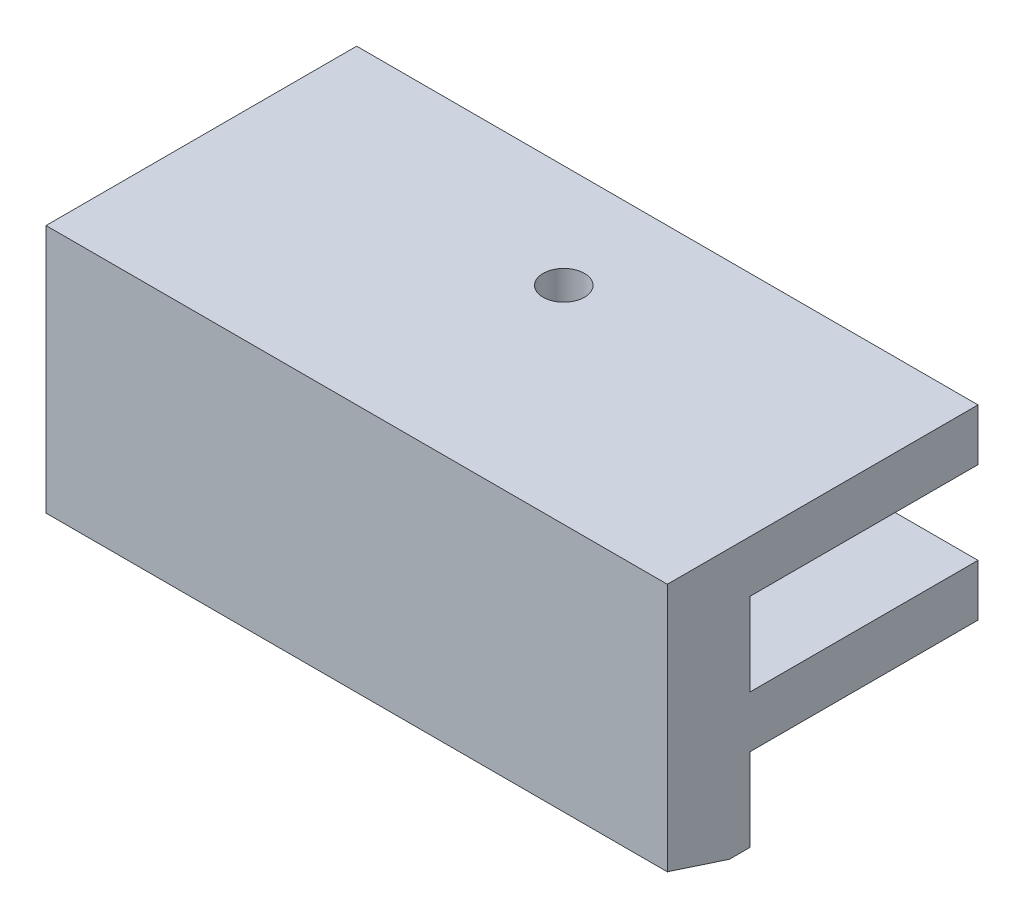
ISO-10303-21;
HEADER;
FILE_DESCRIPTION(('STEP AP214'),'2;1');
FILE_NAME('part.step','',(''),(''),'','','');
FILE_SCHEMA(('AUTOMOTIVE_DESIGN { 1 0 10303 214 1 1 1 1 }'));
ENDSEC;
DATA;
#1=APPLICATION_CONTEXT('core data for automotive mechanical design processes');
#2=APPLICATION_PROTOCOL_DEFINITION('international standard','automotive_design',2000,#1);
#3=PRODUCT_CONTEXT('',#1,'mechanical');
#4=PRODUCT('Part','Part','',(#3));
#5=PRODUCT_RELATED_PRODUCT_CATEGORY('part','',(#4));
#6=PRODUCT_DEFINITION_FORMATION('','',#4);
#7=PRODUCT_DEFINITION_CONTEXT('part definition',#1,'design');
#8=PRODUCT_DEFINITION('design','',#6,#7);
#9=PRODUCT_DEFINITION_SHAPE('','',#8);
#10=(LENGTH_UNIT() NAMED_UNIT(*) SI_UNIT(.MILLI.,.METRE.));
#11=(NAMED_UNIT(*) PLANE_ANGLE_UNIT() SI_UNIT($,.RADIAN.));
#12=(NAMED_UNIT(*) SI_UNIT($,.STERADIAN.) SOLID_ANGLE_UNIT());
#13=UNCERTAINTY_MEASURE_WITH_UNIT(LENGTH_MEASURE(1.E-05),#10,'distance_accuracy_value','');
#14=(GEOMETRIC_REPRESENTATION_CONTEXT(3) GLOBAL_UNCERTAINTY_ASSIGNED_CONTEXT((#13)) GLOBAL_UNIT_ASSIGNED_CONTEXT((#10,
#11,#12)) REPRESENTATION_CONTEXT('',''));
#15=CARTESIAN_POINT('',(0.,0.,0.));
#16=DIRECTION('',(0.,0.,1.));
#17=DIRECTION('',(1.,0.,0.));
#18=AXIS2_PLACEMENT_3D('',#15,#16,#17);
#19=CARTESIAN_POINT('',(0.,2.5,0.));
#20=DIRECTION('',(0.,1.,0.));
#21=DIRECTION('',(0.,0.,1.));
#22=AXIS2_PLACEMENT_3D('',#19,#20,#21);
#23=PLANE('',#22);
#24=DIRECTION('',(-1.,0.,0.));
#25=VECTOR('',#24,1.);
#26=CARTESIAN_POINT('',(0.,2.5,3.5));
#27=LINE('',#26,#25);
#28=CARTESIAN_POINT('',(15.,2.5,3.5));
#29=VERTEX_POINT('',#28);
#30=CARTESIAN_POINT('',(-15.,2.5,3.5));
#31=VERTEX_POINT('',#30);
#32=EDGE_CURVE('E172',#29,#31,#27,.T.);
#33=ORIENTED_EDGE('',*,*,#32,.F.);
#34=DIRECTION('',(0.,0.,-1.));
#35=VECTOR('',#34,1.);
#36=CARTESIAN_POINT('',(15.,2.5,-7.5));
#37=LINE('',#36,#35);
#38=CARTESIAN_POINT('',(15.,2.5,-7.5));
#39=VERTEX_POINT('',#38);
#40=EDGE_CURVE('E182',#29,#39,#37,.T.);
#41=ORIENTED_EDGE('',*,*,#40,.T.);
#42=DIRECTION('',(-1.,0.,0.));
#43=VECTOR('',#42,1.);
#44=CARTESIAN_POINT('',(-15.,2.5,-7.5));
#45=LINE('',#44,#43);
#46=CARTESIAN_POINT('',(-15.,2.5,-7.5));
#47=VERTEX_POINT('',#46);
#48=EDGE_CURVE('E184',#39,#47,#45,.T.);
#49=ORIENTED_EDGE('',*,*,#48,.T.);
#50=DIRECTION('',(0.,0.,1.));
#51=VECTOR('',#50,1.);
#52=CARTESIAN_POINT('',(-15.,2.5,-7.5));
#53=LINE('',#52,#51);
#54=EDGE_CURVE('E187',#47,#31,#53,.T.);
#55=ORIENTED_EDGE('',*,*,#54,.T.);
#56=EDGE_LOOP('',(#33,#41,#49,#55));
#57=FACE_BOUND('',#56,.T.);
#58=CARTESIAN_POINT('',(0.,2.5,-2.5));
#59=DIRECTION('',(0.,1.,0.));
#60=DIRECTION('',(0.,0.,1.));
#61=AXIS2_PLACEMENT_3D('',#58,#59,#60);
#62=CIRCLE('',#61,1.);
#63=CARTESIAN_POINT('',(0.,2.5,-1.5));
#64=VERTEX_POINT('',#63);
#65=EDGE_CURVE('E176',#64,#64,#62,.T.);
#66=ORIENTED_EDGE('',*,*,#65,.F.);
#67=EDGE_LOOP('',(#66));
#68=FACE_BOUND('',#67,.T.);
#69=ADVANCED_FACE('F33',(#57,#68),#23,.T.);
#70=CARTESIAN_POINT('',(0.,0.,0.));
#71=DIRECTION('',(0.,1.,0.));
#72=DIRECTION('',(0.,0.,1.));
#73=AXIS2_PLACEMENT_3D('',#70,#71,#72);
#74=PLANE('',#73);
#75=DIRECTION('',(0.,0.,-1.));
#76=VECTOR('',#75,1.);
#77=CARTESIAN_POINT('',(15.,0.,-7.5));
#78=LINE('',#77,#76);
#79=CARTESIAN_POINT('',(15.,0.,3.5));
#80=VERTEX_POINT('',#79);
#81=CARTESIAN_POINT('',(15.,0.,-7.5));
#82=VERTEX_POINT('',#81);
#83=EDGE_CURVE('E179',#80,#82,#78,.T.);
#84=ORIENTED_EDGE('',*,*,#83,.F.);
#85=DIRECTION('',(-1.,0.,0.));
#86=VECTOR('',#85,1.);
#87=CARTESIAN_POINT('',(0.,0.,3.5));
#88=LINE('',#87,#86);
#89=CARTESIAN_POINT('',(-15.,0.,3.5));
#90=VERTEX_POINT('',#89);
#91=EDGE_CURVE('E165',#80,#90,#88,.T.);
#92=ORIENTED_EDGE('',*,*,#91,.T.);
#93=DIRECTION('',(0.,0.,1.));
#94=VECTOR('',#93,1.);
#95=CARTESIAN_POINT('',(-15.,0.,-7.5));
#96=LINE('',#95,#94);
#97=CARTESIAN_POINT('',(-15.,0.,-7.5));
#98=VERTEX_POINT('',#97);
#99=EDGE_CURVE('E185',#98,#90,#96,.T.);
#100=ORIENTED_EDGE('',*,*,#99,.F.);
#101=DIRECTION('',(-1.,0.,0.));
#102=VECTOR('',#101,1.);
#103=CARTESIAN_POINT('',(-15.,0.,-7.5));
#104=LINE('',#103,#102);
#105=EDGE_CURVE('E191',#82,#98,#104,.T.);
#106=ORIENTED_EDGE('',*,*,#105,.F.);
#107=EDGE_LOOP('',(#84,#92,#100,#106));
#108=FACE_BOUND('',#107,.T.);
#109=CARTESIAN_POINT('',(0.,0.,-2.5));
#110=DIRECTION('',(0.,1.,0.));
#111=DIRECTION('',(0.,0.,1.));
#112=AXIS2_PLACEMENT_3D('',#109,#110,#111);
#113=CIRCLE('',#112,1.);
#114=CARTESIAN_POINT('',(0.,0.,-1.5));
#115=VERTEX_POINT('',#114);
#116=EDGE_CURVE('E175',#115,#115,#113,.T.);
#117=ORIENTED_EDGE('',*,*,#116,.T.);
#118=EDGE_LOOP('',(#117));
#119=FACE_BOUND('',#118,.T.);
#120=ADVANCED_FACE('F233',(#108,#119),#74,.F.);
#121=CARTESIAN_POINT('',(15.,2.5,-7.5));
#122=DIRECTION('',(-1.,0.,0.));
#123=DIRECTION('',(0.,0.,1.));
#124=AXIS2_PLACEMENT_3D('',#121,#122,#123);
#125=PLANE('',#124);
#126=DIRECTION('',(0.,-1.,0.));
#127=VECTOR('',#126,1.);
#128=CARTESIAN_POINT('',(15.,2.5,7.5));
#129=LINE('',#128,#127);
#130=CARTESIAN_POINT('',(15.,9.,7.5));
#131=VERTEX_POINT('',#130);
#132=CARTESIAN_POINT('',(15.,-3.02524091130128,7.5));
#133=VERTEX_POINT('',#132);
#134=EDGE_CURVE('E189',#131,#133,#129,.T.);
#135=ORIENTED_EDGE('',*,*,#134,.T.);
#136=DIRECTION('',(0.,-0.309016994374945,-0.951056516295154));
#137=VECTOR('',#136,1.);
#138=CARTESIAN_POINT('',(15.,-3.02524091130128,7.49999999999999));
#139=LINE('',#138,#137);
#140=CARTESIAN_POINT('',(15.,-4.,4.49999999999996));
#141=VERTEX_POINT('',#140);
#142=EDGE_CURVE('E55',#133,#141,#139,.T.);
#143=ORIENTED_EDGE('',*,*,#142,.T.);
#144=DIRECTION('',(0.,0.,-1.));
#145=VECTOR('',#144,1.);
#146=CARTESIAN_POINT('',(15.,-4.,7.5));
#147=LINE('',#146,#145);
#148=CARTESIAN_POINT('',(15.,-4.,3.5));
#149=VERTEX_POINT('',#148);
#150=EDGE_CURVE('E157',#141,#149,#147,.T.);
#151=ORIENTED_EDGE('',*,*,#150,.T.);
#152=DIRECTION('',(0.,1.,0.));
#153=VECTOR('',#152,1.);
#154=CARTESIAN_POINT('',(15.,-4.,3.5));
#155=LINE('',#154,#153);
#156=EDGE_CURVE('E167',#149,#80,#155,.T.);
#157=ORIENTED_EDGE('',*,*,#156,.T.);
#158=ORIENTED_EDGE('',*,*,#83,.T.);
#159=DIRECTION('',(0.,-1.,0.));
#160=VECTOR('',#159,1.);
#161=CARTESIAN_POINT('',(15.,2.5,-7.5));
#162=LINE('',#161,#160);
#163=EDGE_CURVE('E202',#39,#82,#162,.T.);
#164=ORIENTED_EDGE('',*,*,#163,.F.);
#165=ORIENTED_EDGE('',*,*,#40,.F.);
#166=CARTESIAN_POINT('',(15.,6.5,3.5));
#167=VERTEX_POINT('',#166);
#168=EDGE_CURVE('E162',#29,#167,#155,.T.);
#169=ORIENTED_EDGE('',*,*,#168,.T.);
#170=DIRECTION('',(0.,0.,-1.));
#171=VECTOR('',#170,1.);
#172=CARTESIAN_POINT('',(15.,6.5,-7.5));
#173=LINE('',#172,#171);
#174=CARTESIAN_POINT('',(15.,6.5,-7.5));
#175=VERTEX_POINT('',#174);
#176=EDGE_CURVE('E136',#167,#175,#173,.T.);
#177=ORIENTED_EDGE('',*,*,#176,.T.);
#178=DIRECTION('',(0.,1.,0.));
#179=VECTOR('',#178,1.);
#180=CARTESIAN_POINT('',(15.,6.5,-7.5));
#181=LINE('',#180,#179);
#182=CARTESIAN_POINT('',(15.,9.,-7.5));
#183=VERTEX_POINT('',#182);
#184=EDGE_CURVE('E127',#175,#183,#181,.T.);
#185=ORIENTED_EDGE('',*,*,#184,.T.);
#186=DIRECTION('',(0.,0.,-1.));
#187=VECTOR('',#186,1.);
#188=CARTESIAN_POINT('',(15.,9.,-7.5));
#189=LINE('',#188,#187);
#190=EDGE_CURVE('E144',#131,#183,#189,.T.);
#191=ORIENTED_EDGE('',*,*,#190,.F.);
#192=EDGE_LOOP('',(#135,#143,#151,#157,#158,#164,#165,#169,#177,#185,#191));
#193=FACE_BOUND('',#192,.T.);
#194=ADVANCED_FACE('F215',(#193),#125,.F.);
#195=CARTESIAN_POINT('',(-15.,2.5,-7.5));
#196=DIRECTION('',(0.,0.,1.));
#197=DIRECTION('',(1.,0.,0.));
#198=AXIS2_PLACEMENT_3D('',#195,#196,#197);
#199=PLANE('',#198);
#200=ORIENTED_EDGE('',*,*,#105,.T.);
#201=DIRECTION('',(0.,-1.,0.));
#202=VECTOR('',#201,1.);
#203=CARTESIAN_POINT('',(-15.,2.5,-7.5));
#204=LINE('',#203,#202);
#205=EDGE_CURVE('E199',#47,#98,#204,.T.);
#206=ORIENTED_EDGE('',*,*,#205,.F.);
#207=ORIENTED_EDGE('',*,*,#48,.F.);
#208=ORIENTED_EDGE('',*,*,#163,.T.);
#209=EDGE_LOOP('',(#200,#206,#207,#208));
#210=FACE_BOUND('',#209,.T.);
#211=ADVANCED_FACE('F250',(#210),#199,.F.);
#212=CARTESIAN_POINT('',(-15.,2.5,-7.5));
#213=DIRECTION('',(1.,0.,0.));
#214=DIRECTION('',(0.,0.,-1.));
#215=AXIS2_PLACEMENT_3D('',#212,#213,#214);
#216=PLANE('',#215);
#217=DIRECTION('',(0.,0.,1.));
#218=VECTOR('',#217,1.);
#219=CARTESIAN_POINT('',(-15.,-4.,7.5));
#220=LINE('',#219,#218);
#221=CARTESIAN_POINT('',(-15.,-4.,3.5));
#222=VERTEX_POINT('',#221);
#223=CARTESIAN_POINT('',(-15.,-4.,4.49999999999996));
#224=VERTEX_POINT('',#223);
#225=EDGE_CURVE('E155',#222,#224,#220,.T.);
#226=ORIENTED_EDGE('',*,*,#225,.T.);
#227=DIRECTION('',(0.,0.309016994374945,0.951056516295154));
#228=VECTOR('',#227,1.);
#229=CARTESIAN_POINT('',(-15.,-3.02524091130128,7.5));
#230=LINE('',#229,#228);
#231=CARTESIAN_POINT('',(-15.,-3.02524091130128,7.5));
#232=VERTEX_POINT('',#231);
#233=EDGE_CURVE('E11',#224,#232,#230,.T.);
#234=ORIENTED_EDGE('',*,*,#233,.T.);
#235=DIRECTION('',(0.,-1.,0.));
#236=VECTOR('',#235,1.);
#237=CARTESIAN_POINT('',(-15.,2.5,7.5));
#238=LINE('',#237,#236);
#239=CARTESIAN_POINT('',(-15.,9.,7.5));
#240=VERTEX_POINT('',#239);
#241=EDGE_CURVE('E196',#240,#232,#238,.T.);
#242=ORIENTED_EDGE('',*,*,#241,.F.);
#243=DIRECTION('',(0.,0.,1.));
#244=VECTOR('',#243,1.);
#245=CARTESIAN_POINT('',(-15.,9.,-7.5));
#246=LINE('',#245,#244);
#247=CARTESIAN_POINT('',(-15.,9.,-7.5));
#248=VERTEX_POINT('',#247);
#249=EDGE_CURVE('E121',#248,#240,#246,.T.);
#250=ORIENTED_EDGE('',*,*,#249,.F.);
#251=DIRECTION('',(0.,1.,0.));
#252=VECTOR('',#251,1.);
#253=CARTESIAN_POINT('',(-15.,6.5,-7.5));
#254=LINE('',#253,#252);
#255=CARTESIAN_POINT('',(-15.,6.5,-7.5));
#256=VERTEX_POINT('',#255);
#257=EDGE_CURVE('E115',#256,#248,#254,.T.);
#258=ORIENTED_EDGE('',*,*,#257,.F.);
#259=DIRECTION('',(0.,0.,1.));
#260=VECTOR('',#259,1.);
#261=CARTESIAN_POINT('',(-15.,6.5,-7.5));
#262=LINE('',#261,#260);
#263=CARTESIAN_POINT('',(-15.,6.5,3.5));
#264=VERTEX_POINT('',#263);
#265=EDGE_CURVE('E119',#256,#264,#262,.T.);
#266=ORIENTED_EDGE('',*,*,#265,.T.);
#267=DIRECTION('',(0.,1.,0.));
#268=VECTOR('',#267,1.);
#269=CARTESIAN_POINT('',(-15.,-4.,3.5));
#270=LINE('',#269,#268);
#271=EDGE_CURVE('E166',#31,#264,#270,.T.);
#272=ORIENTED_EDGE('',*,*,#271,.F.);
#273=ORIENTED_EDGE('',*,*,#54,.F.);
#274=ORIENTED_EDGE('',*,*,#205,.T.);
#275=ORIENTED_EDGE('',*,*,#99,.T.);
#276=EDGE_CURVE('E163',#222,#90,#270,.T.);
#277=ORIENTED_EDGE('',*,*,#276,.F.);
#278=EDGE_LOOP('',(#226,#234,#242,#250,#258,#266,#272,#273,#274,#275,#277));
#279=FACE_BOUND('',#278,.T.);
#280=ADVANCED_FACE('F117',(#279),#216,.F.);
#281=CARTESIAN_POINT('',(-15.,2.5,7.5));
#282=DIRECTION('',(0.,0.,-1.));
#283=DIRECTION('',(-1.,0.,0.));
#284=AXIS2_PLACEMENT_3D('',#281,#282,#283);
#285=PLANE('',#284);
#286=ORIENTED_EDGE('',*,*,#241,.T.);
#287=DIRECTION('',(1.,0.,0.));
#288=VECTOR('',#287,1.);
#289=CARTESIAN_POINT('',(15.,-3.02524091130128,7.5));
#290=LINE('',#289,#288);
#291=EDGE_CURVE('E205',#232,#133,#290,.T.);
#292=ORIENTED_EDGE('',*,*,#291,.T.);
#293=ORIENTED_EDGE('',*,*,#134,.F.);
#294=DIRECTION('',(1.,0.,0.));
#295=VECTOR('',#294,1.);
#296=CARTESIAN_POINT('',(-15.,9.,7.5));
#297=LINE('',#296,#295);
#298=EDGE_CURVE('E147',#240,#131,#297,.T.);
#299=ORIENTED_EDGE('',*,*,#298,.F.);
#300=EDGE_LOOP('',(#286,#292,#293,#299));
#301=FACE_BOUND('',#300,.T.);
#302=ADVANCED_FACE('F210',(#301),#285,.F.);
#303=CARTESIAN_POINT('',(0.,2.5,-2.5));
#304=DIRECTION('',(0.,-1.,0.));
#305=DIRECTION('',(0.,0.,-1.));
#306=AXIS2_PLACEMENT_3D('',#303,#304,#305);
#307=CYLINDRICAL_SURFACE('',#306,1.);
#308=ORIENTED_EDGE('',*,*,#65,.T.);
#309=EDGE_LOOP('',(#308));
#310=FACE_BOUND('',#309,.T.);
#311=ORIENTED_EDGE('',*,*,#116,.F.);
#312=EDGE_LOOP('',(#311));
#313=FACE_BOUND('',#312,.T.);
#314=ADVANCED_FACE('F243',(#310,#313),#307,.F.);
#315=CARTESIAN_POINT('',(0.,-4.,0.));
#316=DIRECTION('',(0.,-1.,0.));
#317=DIRECTION('',(0.,0.,-1.));
#318=AXIS2_PLACEMENT_3D('',#315,#316,#317);
#319=PLANE('',#318);
#320=ORIENTED_EDGE('',*,*,#150,.F.);
#321=DIRECTION('',(-1.,0.,0.));
#322=VECTOR('',#321,1.);
#323=CARTESIAN_POINT('',(-15.,-4.,4.49999999999996));
#324=LINE('',#323,#322);
#325=EDGE_CURVE('E41',#141,#224,#324,.T.);
#326=ORIENTED_EDGE('',*,*,#325,.T.);
#327=ORIENTED_EDGE('',*,*,#225,.F.);
#328=DIRECTION('',(-1.,0.,0.));
#329=VECTOR('',#328,1.);
#330=CARTESIAN_POINT('',(-15.,-4.,3.5));
#331=LINE('',#330,#329);
#332=EDGE_CURVE('E159',#149,#222,#331,.T.);
#333=ORIENTED_EDGE('',*,*,#332,.F.);
#334=EDGE_LOOP('',(#320,#326,#327,#333));
#335=FACE_BOUND('',#334,.T.);
#336=ADVANCED_FACE('F278',(#335),#319,.T.);
#337=CARTESIAN_POINT('',(-15.,-4.,3.5));
#338=DIRECTION('',(0.,0.,-1.));
#339=DIRECTION('',(-1.,0.,0.));
#340=AXIS2_PLACEMENT_3D('',#337,#338,#339);
#341=PLANE('',#340);
#342=ORIENTED_EDGE('',*,*,#91,.F.);
#343=ORIENTED_EDGE('',*,*,#156,.F.);
#344=ORIENTED_EDGE('',*,*,#332,.T.);
#345=ORIENTED_EDGE('',*,*,#276,.T.);
#346=EDGE_LOOP('',(#342,#343,#344,#345));
#347=FACE_BOUND('',#346,.T.);
#348=ADVANCED_FACE('F284',(#347),#341,.T.);
#349=ORIENTED_EDGE('',*,*,#168,.F.);
#350=ORIENTED_EDGE('',*,*,#32,.T.);
#351=ORIENTED_EDGE('',*,*,#271,.T.);
#352=DIRECTION('',(-1.,0.,0.));
#353=VECTOR('',#352,1.);
#354=CARTESIAN_POINT('',(-15.,6.5,3.5));
#355=LINE('',#354,#353);
#356=EDGE_CURVE('E126',#167,#264,#355,.T.);
#357=ORIENTED_EDGE('',*,*,#356,.F.);
#358=EDGE_LOOP('',(#349,#350,#351,#357));
#359=FACE_BOUND('',#358,.T.);
#360=ADVANCED_FACE('F292',(#359),#341,.T.);
#361=CARTESIAN_POINT('',(-15.,6.5,-7.5));
#362=DIRECTION('',(0.,0.,-1.));
#363=DIRECTION('',(-1.,0.,0.));
#364=AXIS2_PLACEMENT_3D('',#361,#362,#363);
#365=PLANE('',#364);
#366=DIRECTION('',(-1.,0.,0.));
#367=VECTOR('',#366,1.);
#368=CARTESIAN_POINT('',(-15.,9.,-7.5));
#369=LINE('',#368,#367);
#370=EDGE_CURVE('E152',#183,#248,#369,.T.);
#371=ORIENTED_EDGE('',*,*,#370,.F.);
#372=ORIENTED_EDGE('',*,*,#184,.F.);
#373=DIRECTION('',(-1.,0.,0.));
#374=VECTOR('',#373,1.);
#375=CARTESIAN_POINT('',(-15.,6.5,-7.5));
#376=LINE('',#375,#374);
#377=EDGE_CURVE('E134',#175,#256,#376,.T.);
#378=ORIENTED_EDGE('',*,*,#377,.T.);
#379=ORIENTED_EDGE('',*,*,#257,.T.);
#380=EDGE_LOOP('',(#371,#372,#378,#379));
#381=FACE_BOUND('',#380,.T.);
#382=ADVANCED_FACE('F139',(#381),#365,.T.);
#383=CARTESIAN_POINT('',(0.,6.5,0.));
#384=DIRECTION('',(0.,-1.,0.));
#385=DIRECTION('',(0.,0.,1.));
#386=AXIS2_PLACEMENT_3D('',#383,#384,#385);
#387=PLANE('',#386);
#388=CARTESIAN_POINT('',(0.,6.5,-2.5));
#389=DIRECTION('',(0.,1.,0.));
#390=DIRECTION('',(0.,0.,1.));
#391=AXIS2_PLACEMENT_3D('',#388,#389,#390);
#392=CIRCLE('',#391,1.);
#393=CARTESIAN_POINT('',(0.,6.5,-1.5));
#394=VERTEX_POINT('',#393);
#395=EDGE_CURVE('E148',#394,#394,#392,.T.);
#396=ORIENTED_EDGE('',*,*,#395,.T.);
#397=EDGE_LOOP('',(#396));
#398=FACE_BOUND('',#397,.T.);
#399=ORIENTED_EDGE('',*,*,#176,.F.);
#400=ORIENTED_EDGE('',*,*,#356,.T.);
#401=ORIENTED_EDGE('',*,*,#265,.F.);
#402=ORIENTED_EDGE('',*,*,#377,.F.);
#403=EDGE_LOOP('',(#399,#400,#401,#402));
#404=FACE_BOUND('',#403,.T.);
#405=ADVANCED_FACE('F133',(#398,#404),#387,.T.);
#406=CARTESIAN_POINT('',(0.,9.,0.));
#407=DIRECTION('',(0.,-1.,0.));
#408=DIRECTION('',(0.,0.,1.));
#409=AXIS2_PLACEMENT_3D('',#406,#407,#408);
#410=PLANE('',#409);
#411=CARTESIAN_POINT('',(0.,9.,-2.5));
#412=DIRECTION('',(0.,1.,0.));
#413=DIRECTION('',(0.,0.,1.));
#414=AXIS2_PLACEMENT_3D('',#411,#412,#413);
#415=CIRCLE('',#414,1.);
#416=CARTESIAN_POINT('',(0.,9.,-1.5));
#417=VERTEX_POINT('',#416);
#418=EDGE_CURVE('E339',#417,#417,#415,.T.);
#419=ORIENTED_EDGE('',*,*,#418,.F.);
#420=EDGE_LOOP('',(#419));
#421=FACE_BOUND('',#420,.T.);
#422=ORIENTED_EDGE('',*,*,#190,.T.);
#423=ORIENTED_EDGE('',*,*,#370,.T.);
#424=ORIENTED_EDGE('',*,*,#249,.T.);
#425=ORIENTED_EDGE('',*,*,#298,.T.);
#426=EDGE_LOOP('',(#422,#423,#424,#425));
#427=FACE_BOUND('',#426,.T.);
#428=ADVANCED_FACE('F217',(#421,#427),#410,.F.);
#429=CARTESIAN_POINT('',(0.,6.5,-2.5));
#430=DIRECTION('',(0.,1.,0.));
#431=DIRECTION('',(0.,0.,1.));
#432=AXIS2_PLACEMENT_3D('',#429,#430,#431);
#433=CYLINDRICAL_SURFACE('',#432,1.);
#434=ORIENTED_EDGE('',*,*,#395,.F.);
#435=EDGE_LOOP('',(#434));
#436=FACE_BOUND('',#435,.T.);
#437=ORIENTED_EDGE('',*,*,#418,.T.);
#438=EDGE_LOOP('',(#437));
#439=FACE_BOUND('',#438,.T.);
#440=ADVANCED_FACE('F219',(#436,#439),#433,.F.);
#441=CARTESIAN_POINT('',(-15.,-3.02524091130128,7.5));
#442=DIRECTION('',(0.,-0.951056516295154,0.309016994374945));
#443=DIRECTION('',(-1.,0.,0.));
#444=AXIS2_PLACEMENT_3D('',#441,#442,#443);
#445=PLANE('',#444);
#446=ORIENTED_EDGE('',*,*,#233,.F.);
#447=ORIENTED_EDGE('',*,*,#325,.F.);
#448=ORIENTED_EDGE('',*,*,#142,.F.);
#449=ORIENTED_EDGE('',*,*,#291,.F.);
#450=EDGE_LOOP('',(#446,#447,#448,#449));
#451=FACE_BOUND('',#450,.T.);
#452=ADVANCED_FACE('F35',(#451),#445,.T.);
#453=CLOSED_SHELL('',(#69,#120,#194,#211,#280,#302,#314,#336,#348,#360,#382,#405,#428,#440,#452));
#454=MANIFOLD_SOLID_BREP('B2',#453);
#455=ADVANCED_BREP_SHAPE_REPRESENTATION('',(#18,#454),#14);
#456=SHAPE_DEFINITION_REPRESENTATION(#9,#455);
ENDSEC;
END-ISO-10303-21;
